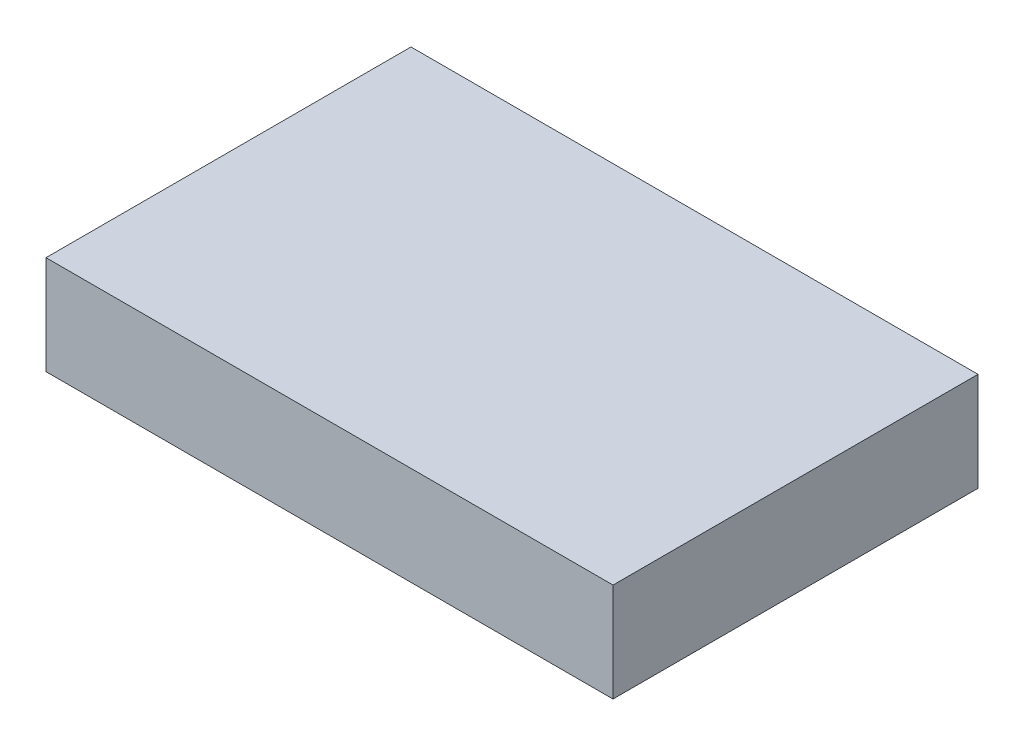
ISO-10303-21;
HEADER;
FILE_DESCRIPTION(('STEP AP214'),'2;1');
FILE_NAME('part.step','',(''),(''),'','','');
FILE_SCHEMA(('AUTOMOTIVE_DESIGN { 1 0 10303 214 1 1 1 1 }'));
ENDSEC;
DATA;
#1=APPLICATION_CONTEXT('core data for automotive mechanical design processes');
#2=APPLICATION_PROTOCOL_DEFINITION('international standard','automotive_design',2000,#1);
#3=PRODUCT_CONTEXT('',#1,'mechanical');
#4=PRODUCT('Part','Part','',(#3));
#5=PRODUCT_RELATED_PRODUCT_CATEGORY('part','',(#4));
#6=PRODUCT_DEFINITION_FORMATION('','',#4);
#7=PRODUCT_DEFINITION_CONTEXT('part definition',#1,'design');
#8=PRODUCT_DEFINITION('design','',#6,#7);
#9=PRODUCT_DEFINITION_SHAPE('','',#8);
#10=(LENGTH_UNIT() NAMED_UNIT(*) SI_UNIT(.MILLI.,.METRE.));
#11=(NAMED_UNIT(*) PLANE_ANGLE_UNIT() SI_UNIT($,.RADIAN.));
#12=(NAMED_UNIT(*) SI_UNIT($,.STERADIAN.) SOLID_ANGLE_UNIT());
#13=UNCERTAINTY_MEASURE_WITH_UNIT(LENGTH_MEASURE(1.E-05),#10,'distance_accuracy_value','');
#14=(GEOMETRIC_REPRESENTATION_CONTEXT(3) GLOBAL_UNCERTAINTY_ASSIGNED_CONTEXT((#13)) GLOBAL_UNIT_ASSIGNED_CONTEXT((#10,
#11,#12)) REPRESENTATION_CONTEXT('',''));
#15=CARTESIAN_POINT('',(0.,0.,0.));
#16=DIRECTION('',(0.,0.,1.));
#17=DIRECTION('',(1.,0.,0.));
#18=AXIS2_PLACEMENT_3D('',#15,#16,#17);
#19=CARTESIAN_POINT('',(-43.5,15.15,28.));
#20=DIRECTION('',(1.,0.,0.));
#21=DIRECTION('',(0.,0.,-1.));
#22=AXIS2_PLACEMENT_3D('',#19,#20,#21);
#23=PLANE('',#22);
#24=DIRECTION('',(0.,0.,1.));
#25=VECTOR('',#24,1.);
#26=CARTESIAN_POINT('',(-43.5,0.,28.));
#27=LINE('',#26,#25);
#28=CARTESIAN_POINT('',(-43.5,0.,-28.));
#29=VERTEX_POINT('',#28);
#30=CARTESIAN_POINT('',(-43.5,0.,28.));
#31=VERTEX_POINT('',#30);
#32=EDGE_CURVE('E110',#29,#31,#27,.T.);
#33=ORIENTED_EDGE('',*,*,#32,.T.);
#34=DIRECTION('',(0.,-1.,0.));
#35=VECTOR('',#34,1.);
#36=CARTESIAN_POINT('',(-43.5,15.15,28.));
#37=LINE('',#36,#35);
#38=CARTESIAN_POINT('',(-43.5,15.15,28.));
#39=VERTEX_POINT('',#38);
#40=EDGE_CURVE('E11',#39,#31,#37,.T.);
#41=ORIENTED_EDGE('',*,*,#40,.F.);
#42=DIRECTION('',(0.,0.,1.));
#43=VECTOR('',#42,1.);
#44=CARTESIAN_POINT('',(-43.5,15.15,28.));
#45=LINE('',#44,#43);
#46=CARTESIAN_POINT('',(-43.5,15.15,-28.));
#47=VERTEX_POINT('',#46);
#48=EDGE_CURVE('E94',#47,#39,#45,.T.);
#49=ORIENTED_EDGE('',*,*,#48,.F.);
#50=DIRECTION('',(0.,-1.,0.));
#51=VECTOR('',#50,1.);
#52=CARTESIAN_POINT('',(-43.5,15.15,-28.));
#53=LINE('',#52,#51);
#54=EDGE_CURVE('E106',#47,#29,#53,.T.);
#55=ORIENTED_EDGE('',*,*,#54,.T.);
#56=EDGE_LOOP('',(#33,#41,#49,#55));
#57=FACE_BOUND('',#56,.T.);
#58=ADVANCED_FACE('F42',(#57),#23,.F.);
#59=CARTESIAN_POINT('',(43.5,15.15,28.));
#60=DIRECTION('',(0.,0.,-1.));
#61=DIRECTION('',(-1.,0.,0.));
#62=AXIS2_PLACEMENT_3D('',#59,#60,#61);
#63=PLANE('',#62);
#64=DIRECTION('',(1.,0.,0.));
#65=VECTOR('',#64,1.);
#66=CARTESIAN_POINT('',(43.5,0.,28.));
#67=LINE('',#66,#65);
#68=CARTESIAN_POINT('',(43.5,0.,28.));
#69=VERTEX_POINT('',#68);
#70=EDGE_CURVE('E99',#31,#69,#67,.T.);
#71=ORIENTED_EDGE('',*,*,#70,.T.);
#72=DIRECTION('',(0.,-1.,0.));
#73=VECTOR('',#72,1.);
#74=CARTESIAN_POINT('',(43.5,15.15,28.));
#75=LINE('',#74,#73);
#76=CARTESIAN_POINT('',(43.5,15.15,28.));
#77=VERTEX_POINT('',#76);
#78=EDGE_CURVE('E51',#77,#69,#75,.T.);
#79=ORIENTED_EDGE('',*,*,#78,.F.);
#80=DIRECTION('',(1.,0.,0.));
#81=VECTOR('',#80,1.);
#82=CARTESIAN_POINT('',(43.5,15.15,28.));
#83=LINE('',#82,#81);
#84=EDGE_CURVE('E89',#39,#77,#83,.T.);
#85=ORIENTED_EDGE('',*,*,#84,.F.);
#86=ORIENTED_EDGE('',*,*,#40,.T.);
#87=EDGE_LOOP('',(#71,#79,#85,#86));
#88=FACE_BOUND('',#87,.T.);
#89=ADVANCED_FACE('F98',(#88),#63,.F.);
#90=CARTESIAN_POINT('',(43.5,15.15,28.));
#91=DIRECTION('',(-1.,0.,0.));
#92=DIRECTION('',(0.,0.,1.));
#93=AXIS2_PLACEMENT_3D('',#90,#91,#92);
#94=PLANE('',#93);
#95=DIRECTION('',(0.,0.,-1.));
#96=VECTOR('',#95,1.);
#97=CARTESIAN_POINT('',(43.5,0.,28.));
#98=LINE('',#97,#96);
#99=CARTESIAN_POINT('',(43.5,0.,-28.));
#100=VERTEX_POINT('',#99);
#101=EDGE_CURVE('E76',#69,#100,#98,.T.);
#102=ORIENTED_EDGE('',*,*,#101,.T.);
#103=DIRECTION('',(0.,-1.,0.));
#104=VECTOR('',#103,1.);
#105=CARTESIAN_POINT('',(43.5,15.15,-28.));
#106=LINE('',#105,#104);
#107=CARTESIAN_POINT('',(43.5,15.15,-28.));
#108=VERTEX_POINT('',#107);
#109=EDGE_CURVE('E101',#108,#100,#106,.T.);
#110=ORIENTED_EDGE('',*,*,#109,.F.);
#111=DIRECTION('',(0.,0.,-1.));
#112=VECTOR('',#111,1.);
#113=CARTESIAN_POINT('',(43.5,15.15,28.));
#114=LINE('',#113,#112);
#115=EDGE_CURVE('E92',#77,#108,#114,.T.);
#116=ORIENTED_EDGE('',*,*,#115,.F.);
#117=ORIENTED_EDGE('',*,*,#78,.T.);
#118=EDGE_LOOP('',(#102,#110,#116,#117));
#119=FACE_BOUND('',#118,.T.);
#120=ADVANCED_FACE('F102',(#119),#94,.F.);
#121=CARTESIAN_POINT('',(43.5,15.15,-28.));
#122=DIRECTION('',(0.,0.,1.));
#123=DIRECTION('',(1.,0.,0.));
#124=AXIS2_PLACEMENT_3D('',#121,#122,#123);
#125=PLANE('',#124);
#126=DIRECTION('',(-1.,0.,0.));
#127=VECTOR('',#126,1.);
#128=CARTESIAN_POINT('',(43.5,0.,-28.));
#129=LINE('',#128,#127);
#130=EDGE_CURVE('E82',#100,#29,#129,.T.);
#131=ORIENTED_EDGE('',*,*,#130,.T.);
#132=ORIENTED_EDGE('',*,*,#54,.F.);
#133=DIRECTION('',(-1.,0.,0.));
#134=VECTOR('',#133,1.);
#135=CARTESIAN_POINT('',(43.5,15.15,-28.));
#136=LINE('',#135,#134);
#137=EDGE_CURVE('E59',#108,#47,#136,.T.);
#138=ORIENTED_EDGE('',*,*,#137,.F.);
#139=ORIENTED_EDGE('',*,*,#109,.T.);
#140=EDGE_LOOP('',(#131,#132,#138,#139));
#141=FACE_BOUND('',#140,.T.);
#142=ADVANCED_FACE('F124',(#141),#125,.F.);
#143=CARTESIAN_POINT('',(0.,15.15,0.));
#144=DIRECTION('',(0.,1.,0.));
#145=DIRECTION('',(0.,0.,1.));
#146=AXIS2_PLACEMENT_3D('',#143,#144,#145);
#147=PLANE('',#146);
#148=ORIENTED_EDGE('',*,*,#48,.T.);
#149=ORIENTED_EDGE('',*,*,#84,.T.);
#150=ORIENTED_EDGE('',*,*,#115,.T.);
#151=ORIENTED_EDGE('',*,*,#137,.T.);
#152=EDGE_LOOP('',(#148,#149,#150,#151));
#153=FACE_BOUND('',#152,.T.);
#154=ADVANCED_FACE('F90',(#153),#147,.T.);
#155=CARTESIAN_POINT('',(0.,0.,0.));
#156=DIRECTION('',(0.,1.,0.));
#157=DIRECTION('',(0.,0.,1.));
#158=AXIS2_PLACEMENT_3D('',#155,#156,#157);
#159=PLANE('',#158);
#160=CARTESIAN_POINT('',(-18.085512482193,0.,24.5));
#161=DIRECTION('',(0.,-1.,0.));
#162=DIRECTION('',(0.,0.,-1.));
#163=AXIS2_PLACEMENT_3D('',#160,#161,#162);
#164=CIRCLE('',#163,1.36449971279379);
#165=CARTESIAN_POINT('',(-18.085512482193,0.,23.1355002872062));
#166=VERTEX_POINT('',#165);
#167=EDGE_CURVE('E143',#166,#166,#164,.T.);
#168=ORIENTED_EDGE('',*,*,#167,.F.);
#169=EDGE_LOOP('',(#168));
#170=FACE_BOUND('',#169,.T.);
#171=CARTESIAN_POINT('',(-17.7369584017945,0.,18.3009139247116));
#172=DIRECTION('',(0.,-1.,0.));
#173=DIRECTION('',(0.,0.,-1.));
#174=AXIS2_PLACEMENT_3D('',#171,#172,#173);
#175=CIRCLE('',#174,1.5);
#176=CARTESIAN_POINT('',(-17.7369584017945,0.,16.8009139247116));
#177=VERTEX_POINT('',#176);
#178=EDGE_CURVE('E151',#177,#177,#175,.T.);
#179=ORIENTED_EDGE('',*,*,#178,.F.);
#180=EDGE_LOOP('',(#179));
#181=FACE_BOUND('',#180,.T.);
#182=CARTESIAN_POINT('',(-18.085512482193,0.,-24.5));
#183=DIRECTION('',(0.,-1.,0.));
#184=DIRECTION('',(0.,0.,-1.));
#185=AXIS2_PLACEMENT_3D('',#182,#183,#184);
#186=CIRCLE('',#185,1.36449971279381);
#187=CARTESIAN_POINT('',(-18.085512482193,0.,-25.8644997127938));
#188=VERTEX_POINT('',#187);
#189=EDGE_CURVE('E159',#188,#188,#186,.T.);
#190=ORIENTED_EDGE('',*,*,#189,.F.);
#191=EDGE_LOOP('',(#190));
#192=FACE_BOUND('',#191,.T.);
#193=CARTESIAN_POINT('',(40.,0.,-24.5));
#194=DIRECTION('',(0.,-1.,0.));
#195=DIRECTION('',(0.,0.,-1.));
#196=AXIS2_PLACEMENT_3D('',#193,#194,#195);
#197=CIRCLE('',#196,1.3644997127938);
#198=CARTESIAN_POINT('',(40.,0.,-25.8644997127938));
#199=VERTEX_POINT('',#198);
#200=EDGE_CURVE('E167',#199,#199,#197,.T.);
#201=ORIENTED_EDGE('',*,*,#200,.F.);
#202=EDGE_LOOP('',(#201));
#203=FACE_BOUND('',#202,.T.);
#204=CARTESIAN_POINT('',(40.0327440327399,0.,-18.4510554311779));
#205=DIRECTION('',(0.,-1.,0.));
#206=DIRECTION('',(0.,0.,-1.));
#207=AXIS2_PLACEMENT_3D('',#204,#205,#206);
#208=CIRCLE('',#207,1.5);
#209=CARTESIAN_POINT('',(40.0327440327399,0.,-19.9510554311779));
#210=VERTEX_POINT('',#209);
#211=EDGE_CURVE('E135',#210,#210,#208,.T.);
#212=ORIENTED_EDGE('',*,*,#211,.F.);
#213=EDGE_LOOP('',(#212));
#214=FACE_BOUND('',#213,.T.);
#215=CARTESIAN_POINT('',(40.,0.,24.5));
#216=DIRECTION('',(0.,-1.,0.));
#217=DIRECTION('',(0.,0.,-1.));
#218=AXIS2_PLACEMENT_3D('',#215,#216,#217);
#219=CIRCLE('',#218,1.3644997127938);
#220=CARTESIAN_POINT('',(40.,0.,23.1355002872062));
#221=VERTEX_POINT('',#220);
#222=EDGE_CURVE('E131',#221,#221,#219,.T.);
#223=ORIENTED_EDGE('',*,*,#222,.F.);
#224=EDGE_LOOP('',(#223));
#225=FACE_BOUND('',#224,.T.);
#226=ORIENTED_EDGE('',*,*,#32,.F.);
#227=ORIENTED_EDGE('',*,*,#130,.F.);
#228=ORIENTED_EDGE('',*,*,#101,.F.);
#229=ORIENTED_EDGE('',*,*,#70,.F.);
#230=EDGE_LOOP('',(#226,#227,#228,#229));
#231=FACE_BOUND('',#230,.T.);
#232=ADVANCED_FACE('F127',(#170,#181,#192,#203,#214,#225,#231),#159,.F.);
#233=CARTESIAN_POINT('',(40.,10.,24.5));
#234=DIRECTION('',(0.,-1.,0.));
#235=DIRECTION('',(0.,0.,-1.));
#236=AXIS2_PLACEMENT_3D('',#233,#234,#235);
#237=CYLINDRICAL_SURFACE('',#236,1.3644997127938);
#238=CARTESIAN_POINT('',(40.,10.,24.5));
#239=DIRECTION('',(0.,-1.,0.));
#240=DIRECTION('',(0.,0.,-1.));
#241=AXIS2_PLACEMENT_3D('',#238,#239,#240);
#242=CIRCLE('',#241,1.3644997127938);
#243=CARTESIAN_POINT('',(40.,10.,23.1355002872062));
#244=VERTEX_POINT('',#243);
#245=EDGE_CURVE('E114',#244,#244,#242,.T.);
#246=ORIENTED_EDGE('',*,*,#245,.F.);
#247=EDGE_LOOP('',(#246));
#248=FACE_BOUND('',#247,.T.);
#249=ORIENTED_EDGE('',*,*,#222,.T.);
#250=EDGE_LOOP('',(#249));
#251=FACE_BOUND('',#250,.T.);
#252=ADVANCED_FACE('F183',(#248,#251),#237,.F.);
#253=CARTESIAN_POINT('',(40.,10.,24.5));
#254=DIRECTION('',(0.,-1.,0.));
#255=DIRECTION('',(0.,0.,-1.));
#256=AXIS2_PLACEMENT_3D('',#253,#254,#255);
#257=PLANE('',#256);
#258=ORIENTED_EDGE('',*,*,#245,.T.);
#259=EDGE_LOOP('',(#258));
#260=FACE_BOUND('',#259,.T.);
#261=ADVANCED_FACE('F189',(#260),#257,.T.);
#262=CARTESIAN_POINT('',(40.0327440327399,10.,-18.4510554311779));
#263=DIRECTION('',(0.,-1.,0.));
#264=DIRECTION('',(0.,0.,-1.));
#265=AXIS2_PLACEMENT_3D('',#262,#263,#264);
#266=CYLINDRICAL_SURFACE('',#265,1.5);
#267=CARTESIAN_POINT('',(40.0327440327399,10.,-18.4510554311779));
#268=DIRECTION('',(0.,-1.,0.));
#269=DIRECTION('',(0.,0.,-1.));
#270=AXIS2_PLACEMENT_3D('',#267,#268,#269);
#271=CIRCLE('',#270,1.5);
#272=CARTESIAN_POINT('',(40.0327440327399,10.,-19.9510554311779));
#273=VERTEX_POINT('',#272);
#274=EDGE_CURVE('E171',#273,#273,#271,.T.);
#275=ORIENTED_EDGE('',*,*,#274,.F.);
#276=EDGE_LOOP('',(#275));
#277=FACE_BOUND('',#276,.T.);
#278=ORIENTED_EDGE('',*,*,#211,.T.);
#279=EDGE_LOOP('',(#278));
#280=FACE_BOUND('',#279,.T.);
#281=ADVANCED_FACE('F179',(#277,#280),#266,.F.);
#282=CARTESIAN_POINT('',(40.0327440327399,10.,-18.4510554311779));
#283=DIRECTION('',(0.,-1.,0.));
#284=DIRECTION('',(0.,0.,-1.));
#285=AXIS2_PLACEMENT_3D('',#282,#283,#284);
#286=PLANE('',#285);
#287=ORIENTED_EDGE('',*,*,#274,.T.);
#288=EDGE_LOOP('',(#287));
#289=FACE_BOUND('',#288,.T.);
#290=ADVANCED_FACE('F240',(#289),#286,.T.);
#291=CARTESIAN_POINT('',(40.,10.,-24.5));
#292=DIRECTION('',(0.,-1.,0.));
#293=DIRECTION('',(0.,0.,-1.));
#294=AXIS2_PLACEMENT_3D('',#291,#292,#293);
#295=CYLINDRICAL_SURFACE('',#294,1.3644997127938);
#296=CARTESIAN_POINT('',(40.,10.,-24.5));
#297=DIRECTION('',(0.,-1.,0.));
#298=DIRECTION('',(0.,0.,-1.));
#299=AXIS2_PLACEMENT_3D('',#296,#297,#298);
#300=CIRCLE('',#299,1.3644997127938);
#301=CARTESIAN_POINT('',(40.,10.,-25.8644997127938));
#302=VERTEX_POINT('',#301);
#303=EDGE_CURVE('E163',#302,#302,#300,.T.);
#304=ORIENTED_EDGE('',*,*,#303,.F.);
#305=EDGE_LOOP('',(#304));
#306=FACE_BOUND('',#305,.T.);
#307=ORIENTED_EDGE('',*,*,#200,.T.);
#308=EDGE_LOOP('',(#307));
#309=FACE_BOUND('',#308,.T.);
#310=ADVANCED_FACE('F251',(#306,#309),#295,.F.);
#311=CARTESIAN_POINT('',(40.,10.,-24.5));
#312=DIRECTION('',(0.,-1.,0.));
#313=DIRECTION('',(0.,0.,-1.));
#314=AXIS2_PLACEMENT_3D('',#311,#312,#313);
#315=PLANE('',#314);
#316=ORIENTED_EDGE('',*,*,#303,.T.);
#317=EDGE_LOOP('',(#316));
#318=FACE_BOUND('',#317,.T.);
#319=ADVANCED_FACE('F262',(#318),#315,.T.);
#320=CARTESIAN_POINT('',(-18.085512482193,10.,-24.5));
#321=DIRECTION('',(0.,-1.,0.));
#322=DIRECTION('',(0.,0.,-1.));
#323=AXIS2_PLACEMENT_3D('',#320,#321,#322);
#324=CYLINDRICAL_SURFACE('',#323,1.36449971279381);
#325=CARTESIAN_POINT('',(-18.085512482193,10.,-24.5));
#326=DIRECTION('',(0.,-1.,0.));
#327=DIRECTION('',(0.,0.,-1.));
#328=AXIS2_PLACEMENT_3D('',#325,#326,#327);
#329=CIRCLE('',#328,1.36449971279381);
#330=CARTESIAN_POINT('',(-18.085512482193,10.,-25.8644997127938));
#331=VERTEX_POINT('',#330);
#332=EDGE_CURVE('E155',#331,#331,#329,.T.);
#333=ORIENTED_EDGE('',*,*,#332,.F.);
#334=EDGE_LOOP('',(#333));
#335=FACE_BOUND('',#334,.T.);
#336=ORIENTED_EDGE('',*,*,#189,.T.);
#337=EDGE_LOOP('',(#336));
#338=FACE_BOUND('',#337,.T.);
#339=ADVANCED_FACE('F273',(#335,#338),#324,.F.);
#340=CARTESIAN_POINT('',(-18.085512482193,10.,-24.5));
#341=DIRECTION('',(0.,-1.,0.));
#342=DIRECTION('',(0.,0.,-1.));
#343=AXIS2_PLACEMENT_3D('',#340,#341,#342);
#344=PLANE('',#343);
#345=ORIENTED_EDGE('',*,*,#332,.T.);
#346=EDGE_LOOP('',(#345));
#347=FACE_BOUND('',#346,.T.);
#348=ADVANCED_FACE('F284',(#347),#344,.T.);
#349=CARTESIAN_POINT('',(-17.7369584017945,10.,18.3009139247116));
#350=DIRECTION('',(0.,-1.,0.));
#351=DIRECTION('',(0.,0.,-1.));
#352=AXIS2_PLACEMENT_3D('',#349,#350,#351);
#353=CYLINDRICAL_SURFACE('',#352,1.5);
#354=CARTESIAN_POINT('',(-17.7369584017945,10.,18.3009139247116));
#355=DIRECTION('',(0.,-1.,0.));
#356=DIRECTION('',(0.,0.,-1.));
#357=AXIS2_PLACEMENT_3D('',#354,#355,#356);
#358=CIRCLE('',#357,1.5);
#359=CARTESIAN_POINT('',(-17.7369584017945,10.,16.8009139247116));
#360=VERTEX_POINT('',#359);
#361=EDGE_CURVE('E147',#360,#360,#358,.T.);
#362=ORIENTED_EDGE('',*,*,#361,.F.);
#363=EDGE_LOOP('',(#362));
#364=FACE_BOUND('',#363,.T.);
#365=ORIENTED_EDGE('',*,*,#178,.T.);
#366=EDGE_LOOP('',(#365));
#367=FACE_BOUND('',#366,.T.);
#368=ADVANCED_FACE('F295',(#364,#367),#353,.F.);
#369=CARTESIAN_POINT('',(-17.7369584017945,10.,18.3009139247116));
#370=DIRECTION('',(0.,-1.,0.));
#371=DIRECTION('',(0.,0.,-1.));
#372=AXIS2_PLACEMENT_3D('',#369,#370,#371);
#373=PLANE('',#372);
#374=ORIENTED_EDGE('',*,*,#361,.T.);
#375=EDGE_LOOP('',(#374));
#376=FACE_BOUND('',#375,.T.);
#377=ADVANCED_FACE('F306',(#376),#373,.T.);
#378=CARTESIAN_POINT('',(-18.085512482193,10.,24.5));
#379=DIRECTION('',(0.,-1.,0.));
#380=DIRECTION('',(0.,0.,-1.));
#381=AXIS2_PLACEMENT_3D('',#378,#379,#380);
#382=CYLINDRICAL_SURFACE('',#381,1.36449971279379);
#383=CARTESIAN_POINT('',(-18.085512482193,10.,24.5));
#384=DIRECTION('',(0.,-1.,0.));
#385=DIRECTION('',(0.,0.,-1.));
#386=AXIS2_PLACEMENT_3D('',#383,#384,#385);
#387=CIRCLE('',#386,1.36449971279379);
#388=CARTESIAN_POINT('',(-18.085512482193,10.,23.1355002872062));
#389=VERTEX_POINT('',#388);
#390=EDGE_CURVE('E139',#389,#389,#387,.T.);
#391=ORIENTED_EDGE('',*,*,#390,.F.);
#392=EDGE_LOOP('',(#391));
#393=FACE_BOUND('',#392,.T.);
#394=ORIENTED_EDGE('',*,*,#167,.T.);
#395=EDGE_LOOP('',(#394));
#396=FACE_BOUND('',#395,.T.);
#397=ADVANCED_FACE('F317',(#393,#396),#382,.F.);
#398=CARTESIAN_POINT('',(-18.085512482193,10.,24.5));
#399=DIRECTION('',(0.,-1.,0.));
#400=DIRECTION('',(0.,0.,-1.));
#401=AXIS2_PLACEMENT_3D('',#398,#399,#400);
#402=PLANE('',#401);
#403=ORIENTED_EDGE('',*,*,#390,.T.);
#404=EDGE_LOOP('',(#403));
#405=FACE_BOUND('',#404,.T.);
#406=ADVANCED_FACE('F328',(#405),#402,.T.);
#407=CLOSED_SHELL('',(#58,#89,#120,#142,#154,#232,#252,#261,#281,#290,#310,#319,#339,#348,#368,
#377,#397,#406));
#408=MANIFOLD_SOLID_BREP('B2',#407);
#409=ADVANCED_BREP_SHAPE_REPRESENTATION('',(#18,#408),#14);
#410=SHAPE_DEFINITION_REPRESENTATION(#9,#409);
ENDSEC;
END-ISO-10303-21;
